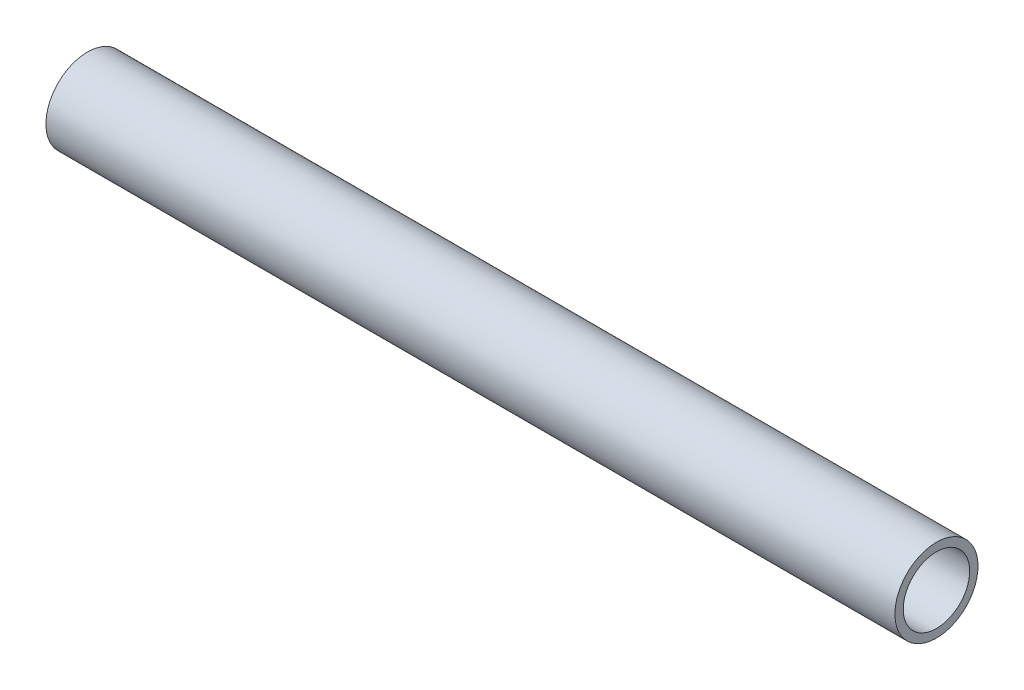
ISO-10303-21;
HEADER;
FILE_DESCRIPTION(('STEP AP214'),'2;1');
FILE_NAME('part.step','',(''),(''),'','','');
FILE_SCHEMA(('AUTOMOTIVE_DESIGN { 1 0 10303 214 1 1 1 1 }'));
ENDSEC;
DATA;
#1=APPLICATION_CONTEXT('core data for automotive mechanical design processes');
#2=APPLICATION_PROTOCOL_DEFINITION('international standard','automotive_design',2000,#1);
#3=PRODUCT_CONTEXT('',#1,'mechanical');
#4=PRODUCT('Part','Part','',(#3));
#5=PRODUCT_RELATED_PRODUCT_CATEGORY('part','',(#4));
#6=PRODUCT_DEFINITION_FORMATION('','',#4);
#7=PRODUCT_DEFINITION_CONTEXT('part definition',#1,'design');
#8=PRODUCT_DEFINITION('design','',#6,#7);
#9=PRODUCT_DEFINITION_SHAPE('','',#8);
#10=(LENGTH_UNIT() NAMED_UNIT(*) SI_UNIT(.MILLI.,.METRE.));
#11=(NAMED_UNIT(*) PLANE_ANGLE_UNIT() SI_UNIT($,.RADIAN.));
#12=(NAMED_UNIT(*) SI_UNIT($,.STERADIAN.) SOLID_ANGLE_UNIT());
#13=UNCERTAINTY_MEASURE_WITH_UNIT(LENGTH_MEASURE(1.E-05),#10,'distance_accuracy_value','');
#14=(GEOMETRIC_REPRESENTATION_CONTEXT(3) GLOBAL_UNCERTAINTY_ASSIGNED_CONTEXT((#13)) GLOBAL_UNIT_ASSIGNED_CONTEXT((#10,
#11,#12)) REPRESENTATION_CONTEXT('',''));
#15=CARTESIAN_POINT('',(0.,0.,0.));
#16=DIRECTION('',(0.,0.,1.));
#17=DIRECTION('',(1.,0.,0.));
#18=AXIS2_PLACEMENT_3D('',#15,#16,#17);
#19=CARTESIAN_POINT('',(162.243250062,0.,0.));
#20=DIRECTION('',(1.,0.,0.));
#21=DIRECTION('',(0.,0.,-1.));
#22=AXIS2_PLACEMENT_3D('',#19,#20,#21);
#23=PLANE('',#22);
#24=CARTESIAN_POINT('',(162.243250062,0.,0.));
#25=DIRECTION('',(1.,0.,0.));
#26=DIRECTION('',(0.,0.,-1.));
#27=AXIS2_PLACEMENT_3D('',#24,#25,#26);
#28=CIRCLE('',#27,15.875);
#29=CARTESIAN_POINT('',(162.243250062,0.,-15.875));
#30=VERTEX_POINT('',#29);
#31=EDGE_CURVE('E11',#30,#30,#28,.T.);
#32=ORIENTED_EDGE('',*,*,#31,.T.);
#33=EDGE_LOOP('',(#32));
#34=FACE_BOUND('',#33,.T.);
#35=CARTESIAN_POINT('',(162.243250062,0.,0.));
#36=DIRECTION('',(1.,0.,0.));
#37=DIRECTION('',(0.,0.,-1.));
#38=AXIS2_PLACEMENT_3D('',#35,#36,#37);
#39=CIRCLE('',#38,12.7);
#40=CARTESIAN_POINT('',(162.243250062,0.,-12.7));
#41=VERTEX_POINT('',#40);
#42=EDGE_CURVE('E54',#41,#41,#39,.T.);
#43=ORIENTED_EDGE('',*,*,#42,.F.);
#44=EDGE_LOOP('',(#43));
#45=FACE_BOUND('',#44,.T.);
#46=ADVANCED_FACE('F43',(#34,#45),#23,.T.);
#47=CARTESIAN_POINT('',(-162.243250062,0.,0.));
#48=DIRECTION('',(1.,0.,0.));
#49=DIRECTION('',(0.,0.,-1.));
#50=AXIS2_PLACEMENT_3D('',#47,#48,#49);
#51=PLANE('',#50);
#52=CARTESIAN_POINT('',(-162.243250062,0.,0.));
#53=DIRECTION('',(1.,0.,0.));
#54=DIRECTION('',(0.,0.,-1.));
#55=AXIS2_PLACEMENT_3D('',#52,#53,#54);
#56=CIRCLE('',#55,15.875);
#57=CARTESIAN_POINT('',(-162.243250062,0.,-15.875));
#58=VERTEX_POINT('',#57);
#59=EDGE_CURVE('E47',#58,#58,#56,.T.);
#60=ORIENTED_EDGE('',*,*,#59,.F.);
#61=EDGE_LOOP('',(#60));
#62=FACE_BOUND('',#61,.T.);
#63=CARTESIAN_POINT('',(-162.243250062,0.,0.));
#64=DIRECTION('',(1.,0.,0.));
#65=DIRECTION('',(0.,0.,-1.));
#66=AXIS2_PLACEMENT_3D('',#63,#64,#65);
#67=CIRCLE('',#66,12.7);
#68=CARTESIAN_POINT('',(-162.243250062,0.,-12.7));
#69=VERTEX_POINT('',#68);
#70=EDGE_CURVE('E56',#69,#69,#67,.T.);
#71=ORIENTED_EDGE('',*,*,#70,.T.);
#72=EDGE_LOOP('',(#71));
#73=FACE_BOUND('',#72,.T.);
#74=ADVANCED_FACE('F66',(#62,#73),#51,.F.);
#75=CARTESIAN_POINT('',(162.243250062,0.,0.));
#76=DIRECTION('',(-1.,0.,0.));
#77=DIRECTION('',(0.,0.,1.));
#78=AXIS2_PLACEMENT_3D('',#75,#76,#77);
#79=CYLINDRICAL_SURFACE('',#78,15.875);
#80=ORIENTED_EDGE('',*,*,#31,.F.);
#81=EDGE_LOOP('',(#80));
#82=FACE_BOUND('',#81,.T.);
#83=ORIENTED_EDGE('',*,*,#59,.T.);
#84=EDGE_LOOP('',(#83));
#85=FACE_BOUND('',#84,.T.);
#86=ADVANCED_FACE('F45',(#82,#85),#79,.T.);
#87=CARTESIAN_POINT('',(162.243250062,0.,0.));
#88=DIRECTION('',(-1.,0.,0.));
#89=DIRECTION('',(0.,0.,1.));
#90=AXIS2_PLACEMENT_3D('',#87,#88,#89);
#91=CYLINDRICAL_SURFACE('',#90,12.7);
#92=ORIENTED_EDGE('',*,*,#42,.T.);
#93=EDGE_LOOP('',(#92));
#94=FACE_BOUND('',#93,.T.);
#95=ORIENTED_EDGE('',*,*,#70,.F.);
#96=EDGE_LOOP('',(#95));
#97=FACE_BOUND('',#96,.T.);
#98=ADVANCED_FACE('F62',(#94,#97),#91,.F.);
#99=CLOSED_SHELL('',(#46,#74,#86,#98));
#100=MANIFOLD_SOLID_BREP('B2',#99);
#101=ADVANCED_BREP_SHAPE_REPRESENTATION('',(#18,#100),#14);
#102=SHAPE_DEFINITION_REPRESENTATION(#9,#101);
ENDSEC;
END-ISO-10303-21;
